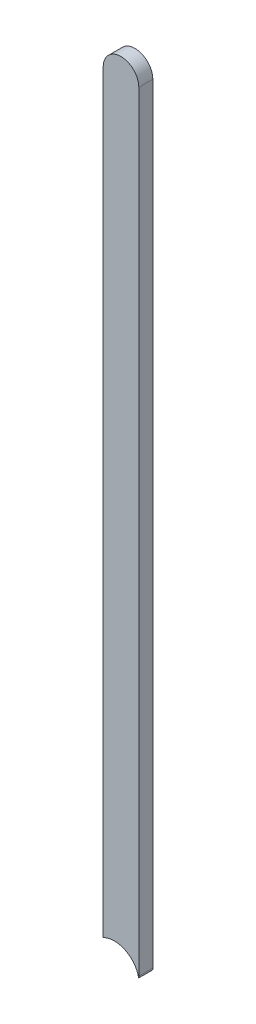
ISO-10303-21;
HEADER;
FILE_DESCRIPTION(('STEP AP214'),'2;1');
FILE_NAME('part.step','',(''),(''),'','','');
FILE_SCHEMA(('AUTOMOTIVE_DESIGN { 1 0 10303 214 1 1 1 1 }'));
ENDSEC;
DATA;
#1=APPLICATION_CONTEXT('core data for automotive mechanical design processes');
#2=APPLICATION_PROTOCOL_DEFINITION('international standard','automotive_design',2000,#1);
#3=PRODUCT_CONTEXT('',#1,'mechanical');
#4=PRODUCT('Part','Part','',(#3));
#5=PRODUCT_RELATED_PRODUCT_CATEGORY('part','',(#4));
#6=PRODUCT_DEFINITION_FORMATION('','',#4);
#7=PRODUCT_DEFINITION_CONTEXT('part definition',#1,'design');
#8=PRODUCT_DEFINITION('design','',#6,#7);
#9=PRODUCT_DEFINITION_SHAPE('','',#8);
#10=(LENGTH_UNIT() NAMED_UNIT(*) SI_UNIT(.MILLI.,.METRE.));
#11=(NAMED_UNIT(*) PLANE_ANGLE_UNIT() SI_UNIT($,.RADIAN.));
#12=(NAMED_UNIT(*) SI_UNIT($,.STERADIAN.) SOLID_ANGLE_UNIT());
#13=UNCERTAINTY_MEASURE_WITH_UNIT(LENGTH_MEASURE(1.E-05),#10,'distance_accuracy_value','');
#14=(GEOMETRIC_REPRESENTATION_CONTEXT(3) GLOBAL_UNCERTAINTY_ASSIGNED_CONTEXT((#13)) GLOBAL_UNIT_ASSIGNED_CONTEXT((#10,
#11,#12)) REPRESENTATION_CONTEXT('',''));
#15=CARTESIAN_POINT('',(0.,0.,0.));
#16=DIRECTION('',(0.,0.,1.));
#17=DIRECTION('',(1.,0.,0.));
#18=AXIS2_PLACEMENT_3D('',#15,#16,#17);
#19=CARTESIAN_POINT('',(138.5254532,93.5674532,0.));
#20=DIRECTION('',(-1.,0.,0.));
#21=DIRECTION('',(0.,1.,0.));
#22=AXIS2_PLACEMENT_3D('',#19,#20,#21);
#23=PLANE('',#22);
#24=DIRECTION('',(0.,1.,0.));
#25=VECTOR('',#24,1.);
#26=CARTESIAN_POINT('',(138.5254532,93.5674532,0.1999996));
#27=LINE('',#26,#25);
#28=CARTESIAN_POINT('',(138.5254532,93.5674532,0.1999996));
#29=VERTEX_POINT('',#28);
#30=CARTESIAN_POINT('',(138.5254532,104.55254934,0.1999996));
#31=VERTEX_POINT('',#30);
#32=EDGE_CURVE('E11',#29,#31,#27,.T.);
#33=ORIENTED_EDGE('',*,*,#32,.F.);
#34=DIRECTION('',(0.,0.,1.));
#35=VECTOR('',#34,1.);
#36=CARTESIAN_POINT('',(138.5254532,93.5674532,0.));
#37=LINE('',#36,#35);
#38=CARTESIAN_POINT('',(138.5254532,93.5674532,0.));
#39=VERTEX_POINT('',#38);
#40=EDGE_CURVE('E24',#39,#29,#37,.T.);
#41=ORIENTED_EDGE('',*,*,#40,.F.);
#42=DIRECTION('',(0.,1.,0.));
#43=VECTOR('',#42,1.);
#44=CARTESIAN_POINT('',(138.5254532,93.5674532,0.));
#45=LINE('',#44,#43);
#46=CARTESIAN_POINT('',(138.5254532,104.55254934,0.));
#47=VERTEX_POINT('',#46);
#48=EDGE_CURVE('E82',#39,#47,#45,.T.);
#49=ORIENTED_EDGE('',*,*,#48,.T.);
#50=DIRECTION('',(0.,0.,1.));
#51=VECTOR('',#50,1.);
#52=CARTESIAN_POINT('',(138.5254532,104.55254934,0.));
#53=LINE('',#52,#51);
#54=EDGE_CURVE('E37',#47,#31,#53,.T.);
#55=ORIENTED_EDGE('',*,*,#54,.T.);
#56=EDGE_LOOP('',(#33,#41,#49,#55));
#57=FACE_BOUND('',#56,.T.);
#58=ADVANCED_FACE('F17',(#57),#23,.F.);
#59=CARTESIAN_POINT('',(138.2714532,104.55254934,0.));
#60=DIRECTION('',(0.,0.,-1.));
#61=DIRECTION('',(1.,0.,0.));
#62=AXIS2_PLACEMENT_3D('',#59,#60,#61);
#63=CYLINDRICAL_SURFACE('',#62,0.254000000000005);
#64=CARTESIAN_POINT('',(138.2714532,104.55254934,0.1999996));
#65=DIRECTION('',(0.,0.,1.));
#66=DIRECTION('',(1.,0.,0.));
#67=AXIS2_PLACEMENT_3D('',#64,#65,#66);
#68=CIRCLE('',#67,0.254000000000005);
#69=CARTESIAN_POINT('',(138.0174532,104.55254934,0.1999996));
#70=VERTEX_POINT('',#69);
#71=EDGE_CURVE('E98',#31,#70,#68,.T.);
#72=ORIENTED_EDGE('',*,*,#71,.F.);
#73=ORIENTED_EDGE('',*,*,#54,.F.);
#74=CARTESIAN_POINT('',(138.2714532,104.55254934,0.));
#75=DIRECTION('',(0.,0.,1.));
#76=DIRECTION('',(1.,0.,0.));
#77=AXIS2_PLACEMENT_3D('',#74,#75,#76);
#78=CIRCLE('',#77,0.254000000000005);
#79=CARTESIAN_POINT('',(138.0174532,104.55254934,0.));
#80=VERTEX_POINT('',#79);
#81=EDGE_CURVE('E95',#47,#80,#78,.T.);
#82=ORIENTED_EDGE('',*,*,#81,.T.);
#83=DIRECTION('',(0.,0.,1.));
#84=VECTOR('',#83,1.);
#85=CARTESIAN_POINT('',(138.0174532,104.55254934,0.));
#86=LINE('',#85,#84);
#87=EDGE_CURVE('E93',#80,#70,#86,.T.);
#88=ORIENTED_EDGE('',*,*,#87,.T.);
#89=EDGE_LOOP('',(#72,#73,#82,#88));
#90=FACE_BOUND('',#89,.T.);
#91=ADVANCED_FACE('F104',(#90),#63,.T.);
#92=CARTESIAN_POINT('',(138.0174532,104.55254934,0.));
#93=DIRECTION('',(1.,0.,0.));
#94=DIRECTION('',(0.,-1.,0.));
#95=AXIS2_PLACEMENT_3D('',#92,#93,#94);
#96=PLANE('',#95);
#97=DIRECTION('',(0.,-1.,0.));
#98=VECTOR('',#97,1.);
#99=CARTESIAN_POINT('',(138.0174532,104.55254934,0.1999996));
#100=LINE('',#99,#98);
#101=CARTESIAN_POINT('',(138.0174532,93.7902990295457,0.1999996));
#102=VERTEX_POINT('',#101);
#103=EDGE_CURVE('E90',#70,#102,#100,.T.);
#104=ORIENTED_EDGE('',*,*,#103,.F.);
#105=ORIENTED_EDGE('',*,*,#87,.F.);
#106=DIRECTION('',(0.,-1.,0.));
#107=VECTOR('',#106,1.);
#108=CARTESIAN_POINT('',(138.0174532,104.55254934,0.));
#109=LINE('',#108,#107);
#110=CARTESIAN_POINT('',(138.0174532,93.7902990295457,0.));
#111=VERTEX_POINT('',#110);
#112=EDGE_CURVE('E88',#80,#111,#109,.T.);
#113=ORIENTED_EDGE('',*,*,#112,.T.);
#114=DIRECTION('',(0.,0.,1.));
#115=VECTOR('',#114,1.);
#116=CARTESIAN_POINT('',(138.0174532,93.7902990295457,0.));
#117=LINE('',#116,#115);
#118=EDGE_CURVE('E69',#111,#102,#117,.T.);
#119=ORIENTED_EDGE('',*,*,#118,.T.);
#120=EDGE_LOOP('',(#104,#105,#113,#119));
#121=FACE_BOUND('',#120,.T.);
#122=ADVANCED_FACE('F109',(#121),#96,.F.);
#123=CARTESIAN_POINT('',(138.176,93.472,0.));
#124=DIRECTION('',(0.,0.,-1.));
#125=DIRECTION('',(1.,0.,0.));
#126=AXIS2_PLACEMENT_3D('',#123,#124,#125);
#127=CYLINDRICAL_SURFACE('',#126,0.3556);
#128=DIRECTION('',(0.,0.,1.));
#129=VECTOR('',#128,1.);
#130=CARTESIAN_POINT('',(138.52432641049,93.5435546766843,0.));
#131=LINE('',#130,#129);
#132=CARTESIAN_POINT('',(138.52432641049,93.5435546766843,0.));
#133=VERTEX_POINT('',#132);
#134=CARTESIAN_POINT('',(138.52432641049,93.5435546766843,0.1999996));
#135=VERTEX_POINT('',#134);
#136=EDGE_CURVE('E59',#133,#135,#131,.T.);
#137=ORIENTED_EDGE('',*,*,#136,.T.);
#138=CARTESIAN_POINT('',(138.176,93.472,0.1999996));
#139=DIRECTION('',(0.,0.,1.));
#140=DIRECTION('',(1.,0.,0.));
#141=AXIS2_PLACEMENT_3D('',#138,#139,#140);
#142=CIRCLE('',#141,0.3556);
#143=EDGE_CURVE('E70',#135,#102,#142,.T.);
#144=ORIENTED_EDGE('',*,*,#143,.T.);
#145=ORIENTED_EDGE('',*,*,#118,.F.);
#146=CARTESIAN_POINT('',(138.176,93.472,0.));
#147=DIRECTION('',(0.,0.,1.));
#148=DIRECTION('',(1.,0.,0.));
#149=AXIS2_PLACEMENT_3D('',#146,#147,#148);
#150=CIRCLE('',#149,0.3556);
#151=EDGE_CURVE('E73',#133,#111,#150,.T.);
#152=ORIENTED_EDGE('',*,*,#151,.F.);
#153=EDGE_LOOP('',(#137,#144,#145,#152));
#154=FACE_BOUND('',#153,.T.);
#155=ADVANCED_FACE('F74',(#154),#127,.F.);
#156=CARTESIAN_POINT('',(138.2714532,93.5674532,0.));
#157=DIRECTION('',(0.,0.,-1.));
#158=DIRECTION('',(-1.,0.,0.));
#159=AXIS2_PLACEMENT_3D('',#156,#157,#158);
#160=CYLINDRICAL_SURFACE('',#159,0.25400000000001);
#161=CARTESIAN_POINT('',(138.2714532,93.5674532,0.1999996));
#162=DIRECTION('',(0.,0.,1.));
#163=DIRECTION('',(-1.,0.,0.));
#164=AXIS2_PLACEMENT_3D('',#161,#162,#163);
#165=CIRCLE('',#164,0.25400000000001);
#166=EDGE_CURVE('E65',#135,#29,#165,.T.);
#167=ORIENTED_EDGE('',*,*,#166,.F.);
#168=ORIENTED_EDGE('',*,*,#136,.F.);
#169=CARTESIAN_POINT('',(138.2714532,93.5674532,0.));
#170=DIRECTION('',(0.,0.,1.));
#171=DIRECTION('',(-1.,0.,0.));
#172=AXIS2_PLACEMENT_3D('',#169,#170,#171);
#173=CIRCLE('',#172,0.25400000000001);
#174=EDGE_CURVE('E63',#133,#39,#173,.T.);
#175=ORIENTED_EDGE('',*,*,#174,.T.);
#176=ORIENTED_EDGE('',*,*,#40,.T.);
#177=EDGE_LOOP('',(#167,#168,#175,#176));
#178=FACE_BOUND('',#177,.T.);
#179=ADVANCED_FACE('F61',(#178),#160,.T.);
#180=CARTESIAN_POINT('',(138.5254532,93.5674532,0.));
#181=DIRECTION('',(0.,0.,-1.));
#182=DIRECTION('',(-1.,0.,0.));
#183=AXIS2_PLACEMENT_3D('',#180,#181,#182);
#184=PLANE('',#183);
#185=ORIENTED_EDGE('',*,*,#48,.F.);
#186=ORIENTED_EDGE('',*,*,#174,.F.);
#187=ORIENTED_EDGE('',*,*,#151,.T.);
#188=ORIENTED_EDGE('',*,*,#112,.F.);
#189=ORIENTED_EDGE('',*,*,#81,.F.);
#190=EDGE_LOOP('',(#185,#186,#187,#188,#189));
#191=FACE_BOUND('',#190,.T.);
#192=ADVANCED_FACE('F80',(#191),#184,.T.);
#193=CARTESIAN_POINT('',(138.5254532,93.5674532,0.1999996));
#194=DIRECTION('',(0.,0.,-1.));
#195=DIRECTION('',(-1.,0.,0.));
#196=AXIS2_PLACEMENT_3D('',#193,#194,#195);
#197=PLANE('',#196);
#198=ORIENTED_EDGE('',*,*,#166,.T.);
#199=ORIENTED_EDGE('',*,*,#32,.T.);
#200=ORIENTED_EDGE('',*,*,#71,.T.);
#201=ORIENTED_EDGE('',*,*,#103,.T.);
#202=ORIENTED_EDGE('',*,*,#143,.F.);
#203=EDGE_LOOP('',(#198,#199,#200,#201,#202));
#204=FACE_BOUND('',#203,.T.);
#205=ADVANCED_FACE('F107',(#204),#197,.F.);
#206=CLOSED_SHELL('',(#58,#91,#122,#155,#179,#192,#205));
#207=MANIFOLD_SOLID_BREP('B1',#206);
#208=ADVANCED_BREP_SHAPE_REPRESENTATION('',(#18,#207),#14);
#209=SHAPE_DEFINITION_REPRESENTATION(#9,#208);
ENDSEC;
END-ISO-10303-21;
